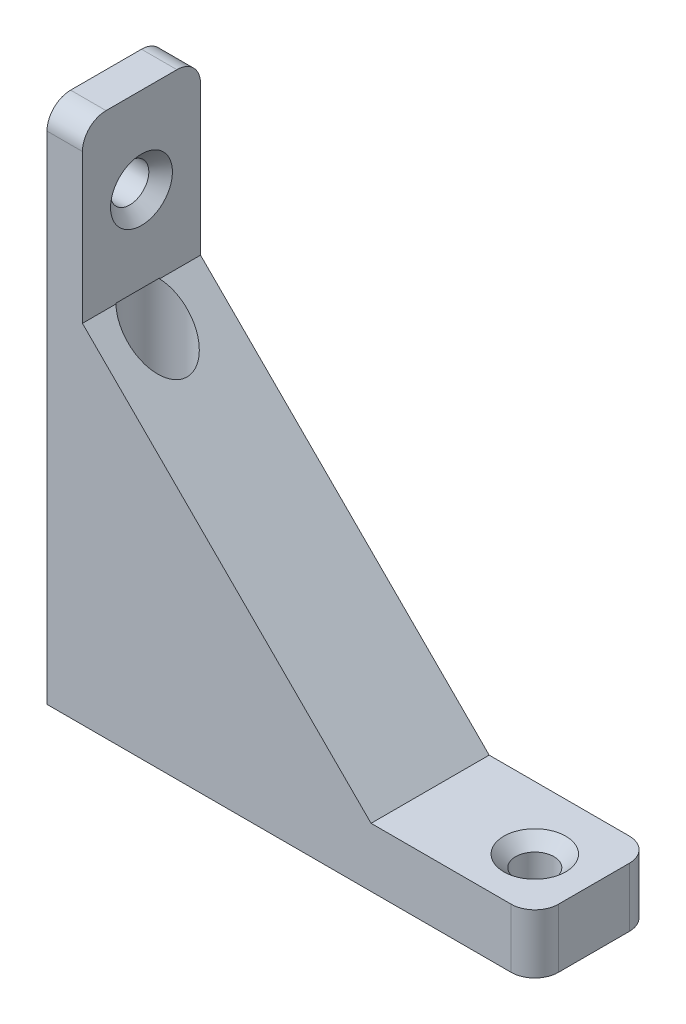
ISO-10303-21;
HEADER;
FILE_DESCRIPTION(('STEP AP214'),'2;1');
FILE_NAME('part.step','',(''),(''),'','','');
FILE_SCHEMA(('AUTOMOTIVE_DESIGN { 1 0 10303 214 1 1 1 1 }'));
ENDSEC;
DATA;
#1=APPLICATION_CONTEXT('core data for automotive mechanical design processes');
#2=APPLICATION_PROTOCOL_DEFINITION('international standard','automotive_design',2000,#1);
#3=PRODUCT_CONTEXT('',#1,'mechanical');
#4=PRODUCT('Part','Part','',(#3));
#5=PRODUCT_RELATED_PRODUCT_CATEGORY('part','',(#4));
#6=PRODUCT_DEFINITION_FORMATION('','',#4);
#7=PRODUCT_DEFINITION_CONTEXT('part definition',#1,'design');
#8=PRODUCT_DEFINITION('design','',#6,#7);
#9=PRODUCT_DEFINITION_SHAPE('','',#8);
#10=(LENGTH_UNIT() NAMED_UNIT(*) SI_UNIT(.MILLI.,.METRE.));
#11=(NAMED_UNIT(*) PLANE_ANGLE_UNIT() SI_UNIT($,.RADIAN.));
#12=(NAMED_UNIT(*) SI_UNIT($,.STERADIAN.) SOLID_ANGLE_UNIT());
#13=UNCERTAINTY_MEASURE_WITH_UNIT(LENGTH_MEASURE(1.E-05),#10,'distance_accuracy_value','');
#14=(GEOMETRIC_REPRESENTATION_CONTEXT(3) GLOBAL_UNCERTAINTY_ASSIGNED_CONTEXT((#13)) GLOBAL_UNIT_ASSIGNED_CONTEXT((#10,
#11,#12)) REPRESENTATION_CONTEXT('',''));
#15=CARTESIAN_POINT('',(0.,0.,0.));
#16=DIRECTION('',(0.,0.,1.));
#17=DIRECTION('',(1.,0.,0.));
#18=AXIS2_PLACEMENT_3D('',#15,#16,#17);
#19=CARTESIAN_POINT('',(3.,29.4386493614491,10.));
#20=DIRECTION('',(-1.,0.,0.));
#21=DIRECTION('',(0.,0.,1.));
#22=AXIS2_PLACEMENT_3D('',#19,#20,#21);
#23=PLANE('',#22);
#24=CARTESIAN_POINT('',(3.,36.7388925496166,5.));
#25=DIRECTION('',(-1.,0.,0.));
#26=DIRECTION('',(0.,0.,1.));
#27=AXIS2_PLACEMENT_3D('',#24,#25,#26);
#28=CIRCLE('',#27,2.62000000000002);
#29=CARTESIAN_POINT('',(3.,36.7388925496166,7.62000000000002));
#30=VERTEX_POINT('',#29);
#31=EDGE_CURVE('E172',#30,#30,#28,.T.);
#32=ORIENTED_EDGE('',*,*,#31,.T.);
#33=EDGE_LOOP('',(#32));
#34=FACE_BOUND('',#33,.T.);
#35=DIRECTION('',(0.,1.,0.));
#36=VECTOR('',#35,1.);
#37=CARTESIAN_POINT('',(3.,29.4386493614491,0.));
#38=LINE('',#37,#36);
#39=CARTESIAN_POINT('',(3.,29.4386493614491,0.));
#40=VERTEX_POINT('',#39);
#41=CARTESIAN_POINT('',(3.,42.039135737784,0.));
#42=VERTEX_POINT('',#41);
#43=EDGE_CURVE('E221',#40,#42,#38,.T.);
#44=ORIENTED_EDGE('',*,*,#43,.T.);
#45=CARTESIAN_POINT('',(3.,42.039135737784,2.));
#46=DIRECTION('',(-1.,0.,0.));
#47=DIRECTION('',(0.,0.,1.));
#48=AXIS2_PLACEMENT_3D('',#45,#46,#47);
#49=CIRCLE('',#48,2.);
#50=CARTESIAN_POINT('',(3.,44.039135737784,2.));
#51=VERTEX_POINT('',#50);
#52=EDGE_CURVE('E200',#42,#51,#49,.F.);
#53=ORIENTED_EDGE('',*,*,#52,.T.);
#54=DIRECTION('',(0.,0.,-1.));
#55=VECTOR('',#54,1.);
#56=CARTESIAN_POINT('',(3.,44.039135737784,10.));
#57=LINE('',#56,#55);
#58=CARTESIAN_POINT('',(3.,44.039135737784,8.));
#59=VERTEX_POINT('',#58);
#60=EDGE_CURVE('E155',#59,#51,#57,.T.);
#61=ORIENTED_EDGE('',*,*,#60,.F.);
#62=CARTESIAN_POINT('',(3.,42.039135737784,8.));
#63=DIRECTION('',(-1.,0.,0.));
#64=DIRECTION('',(0.,0.,1.));
#65=AXIS2_PLACEMENT_3D('',#62,#63,#64);
#66=CIRCLE('',#65,2.);
#67=CARTESIAN_POINT('',(3.,42.039135737784,10.));
#68=VERTEX_POINT('',#67);
#69=EDGE_CURVE('E198',#59,#68,#66,.F.);
#70=ORIENTED_EDGE('',*,*,#69,.T.);
#71=DIRECTION('',(0.,1.,0.));
#72=VECTOR('',#71,1.);
#73=CARTESIAN_POINT('',(3.,29.4386493614491,10.));
#74=LINE('',#73,#72);
#75=CARTESIAN_POINT('',(3.,29.4386493614491,10.));
#76=VERTEX_POINT('',#75);
#77=EDGE_CURVE('E229',#76,#68,#74,.T.);
#78=ORIENTED_EDGE('',*,*,#77,.F.);
#79=DIRECTION('',(0.,0.,-1.));
#80=VECTOR('',#79,1.);
#81=CARTESIAN_POINT('',(3.,29.4386493614491,10.));
#82=LINE('',#81,#80);
#83=CARTESIAN_POINT('',(3.,29.4386493614491,7.17137786526684));
#84=VERTEX_POINT('',#83);
#85=EDGE_CURVE('E254',#76,#84,#82,.T.);
#86=ORIENTED_EDGE('',*,*,#85,.T.);
#87=DIRECTION('',(0.,-1.,0.));
#88=VECTOR('',#87,1.);
#89=CARTESIAN_POINT('',(3.,29.5,7.17137786526684));
#90=LINE('',#89,#88);
#91=CARTESIAN_POINT('',(3.,29.5,7.17137786526684));
#92=VERTEX_POINT('',#91);
#93=EDGE_CURVE('E141',#92,#84,#90,.T.);
#94=ORIENTED_EDGE('',*,*,#93,.F.);
#95=DIRECTION('',(0.,0.,-1.));
#96=VECTOR('',#95,1.);
#97=CARTESIAN_POINT('',(3.,29.5,10.));
#98=LINE('',#97,#96);
#99=CARTESIAN_POINT('',(3.,29.5,3.46862213473316));
#100=VERTEX_POINT('',#99);
#101=EDGE_CURVE('E145',#92,#100,#98,.T.);
#102=ORIENTED_EDGE('',*,*,#101,.T.);
#103=DIRECTION('',(0.,-1.,0.));
#104=VECTOR('',#103,1.);
#105=CARTESIAN_POINT('',(3.,29.5,3.46862213473316));
#106=LINE('',#105,#104);
#107=CARTESIAN_POINT('',(3.,29.4386493614491,3.46862213473316));
#108=VERTEX_POINT('',#107);
#109=EDGE_CURVE('E130',#108,#100,#106,.F.);
#110=ORIENTED_EDGE('',*,*,#109,.F.);
#111=EDGE_CURVE('E242',#108,#40,#82,.T.);
#112=ORIENTED_EDGE('',*,*,#111,.T.);
#113=EDGE_LOOP('',(#44,#53,#61,#70,#78,#86,#94,#102,#110,#112));
#114=FACE_BOUND('',#113,.T.);
#115=ADVANCED_FACE('F35',(#34,#114),#23,.F.);
#116=CARTESIAN_POINT('',(0.,44.039135737784,10.));
#117=DIRECTION('',(0.,1.,0.));
#118=DIRECTION('',(0.,0.,1.));
#119=AXIS2_PLACEMENT_3D('',#116,#117,#118);
#120=PLANE('',#119);
#121=ORIENTED_EDGE('',*,*,#60,.T.);
#122=DIRECTION('',(1.,0.,0.));
#123=VECTOR('',#122,1.);
#124=CARTESIAN_POINT('',(0.,44.039135737784,2.));
#125=LINE('',#124,#123);
#126=CARTESIAN_POINT('',(0.,44.039135737784,2.));
#127=VERTEX_POINT('',#126);
#128=EDGE_CURVE('E50',#51,#127,#125,.F.);
#129=ORIENTED_EDGE('',*,*,#128,.T.);
#130=DIRECTION('',(0.,0.,-1.));
#131=VECTOR('',#130,1.);
#132=CARTESIAN_POINT('',(0.,44.039135737784,10.));
#133=LINE('',#132,#131);
#134=CARTESIAN_POINT('',(0.,44.039135737784,8.));
#135=VERTEX_POINT('',#134);
#136=EDGE_CURVE('E208',#135,#127,#133,.T.);
#137=ORIENTED_EDGE('',*,*,#136,.F.);
#138=DIRECTION('',(1.,0.,0.));
#139=VECTOR('',#138,1.);
#140=CARTESIAN_POINT('',(3.,44.039135737784,8.));
#141=LINE('',#140,#139);
#142=EDGE_CURVE('E202',#135,#59,#141,.T.);
#143=ORIENTED_EDGE('',*,*,#142,.T.);
#144=EDGE_LOOP('',(#121,#129,#137,#143));
#145=FACE_BOUND('',#144,.T.);
#146=ADVANCED_FACE('F207',(#145),#120,.T.);
#147=CARTESIAN_POINT('',(0.,0.,10.));
#148=DIRECTION('',(-1.,0.,0.));
#149=DIRECTION('',(0.,0.,1.));
#150=AXIS2_PLACEMENT_3D('',#147,#148,#149);
#151=PLANE('',#150);
#152=CARTESIAN_POINT('',(0.,36.7388925496166,5.));
#153=DIRECTION('',(-1.,0.,0.));
#154=DIRECTION('',(0.,0.,1.));
#155=AXIS2_PLACEMENT_3D('',#152,#153,#154);
#156=CIRCLE('',#155,1.62);
#157=CARTESIAN_POINT('',(0.,36.7388925496166,6.62));
#158=VERTEX_POINT('',#157);
#159=EDGE_CURVE('E146',#158,#158,#156,.T.);
#160=ORIENTED_EDGE('',*,*,#159,.F.);
#161=EDGE_LOOP('',(#160));
#162=FACE_BOUND('',#161,.T.);
#163=ORIENTED_EDGE('',*,*,#136,.T.);
#164=CARTESIAN_POINT('',(0.,42.039135737784,2.));
#165=DIRECTION('',(-1.,0.,0.));
#166=DIRECTION('',(0.,0.,1.));
#167=AXIS2_PLACEMENT_3D('',#164,#165,#166);
#168=CIRCLE('',#167,2.);
#169=CARTESIAN_POINT('',(0.,42.039135737784,0.));
#170=VERTEX_POINT('',#169);
#171=EDGE_CURVE('E11',#127,#170,#168,.T.);
#172=ORIENTED_EDGE('',*,*,#171,.T.);
#173=DIRECTION('',(0.,1.,0.));
#174=VECTOR('',#173,1.);
#175=CARTESIAN_POINT('',(0.,0.,0.));
#176=LINE('',#175,#174);
#177=CARTESIAN_POINT('',(0.,0.,0.));
#178=VERTEX_POINT('',#177);
#179=EDGE_CURVE('E225',#178,#170,#176,.T.);
#180=ORIENTED_EDGE('',*,*,#179,.F.);
#181=DIRECTION('',(0.,0.,-1.));
#182=VECTOR('',#181,1.);
#183=CARTESIAN_POINT('',(0.,0.,10.));
#184=LINE('',#183,#182);
#185=CARTESIAN_POINT('',(0.,0.,10.));
#186=VERTEX_POINT('',#185);
#187=EDGE_CURVE('E213',#186,#178,#184,.T.);
#188=ORIENTED_EDGE('',*,*,#187,.F.);
#189=DIRECTION('',(0.,1.,0.));
#190=VECTOR('',#189,1.);
#191=CARTESIAN_POINT('',(0.,5.,10.));
#192=LINE('',#191,#190);
#193=CARTESIAN_POINT('',(0.,42.039135737784,10.));
#194=VERTEX_POINT('',#193);
#195=EDGE_CURVE('E231',#186,#194,#192,.T.);
#196=ORIENTED_EDGE('',*,*,#195,.T.);
#197=CARTESIAN_POINT('',(0.,42.039135737784,8.));
#198=DIRECTION('',(-1.,0.,0.));
#199=DIRECTION('',(0.,0.,1.));
#200=AXIS2_PLACEMENT_3D('',#197,#198,#199);
#201=CIRCLE('',#200,2.);
#202=EDGE_CURVE('E43',#194,#135,#201,.T.);
#203=ORIENTED_EDGE('',*,*,#202,.T.);
#204=EDGE_LOOP('',(#163,#172,#180,#188,#196,#203));
#205=FACE_BOUND('',#204,.T.);
#206=ADVANCED_FACE('F275',(#162,#205),#151,.T.);
#207=CARTESIAN_POINT('',(0.,0.,10.));
#208=DIRECTION('',(0.,1.,0.));
#209=DIRECTION('',(0.,0.,1.));
#210=AXIS2_PLACEMENT_3D('',#207,#208,#209);
#211=PLANE('',#210);
#212=CARTESIAN_POINT('',(4.68,0.,5.32));
#213=DIRECTION('',(0.,1.,0.));
#214=DIRECTION('',(0.,0.,1.));
#215=AXIS2_PLACEMENT_3D('',#212,#213,#214);
#216=CIRCLE('',#215,1.62);
#217=CARTESIAN_POINT('',(4.68,0.,6.94));
#218=VERTEX_POINT('',#217);
#219=EDGE_CURVE('E140',#218,#218,#216,.T.);
#220=ORIENTED_EDGE('',*,*,#219,.T.);
#221=EDGE_LOOP('',(#220));
#222=FACE_BOUND('',#221,.T.);
#223=CARTESIAN_POINT('',(36.62,0.,5.32));
#224=DIRECTION('',(0.,1.,0.));
#225=DIRECTION('',(0.,0.,1.));
#226=AXIS2_PLACEMENT_3D('',#223,#224,#225);
#227=CIRCLE('',#226,1.62000000000001);
#228=CARTESIAN_POINT('',(36.62,0.,6.94));
#229=VERTEX_POINT('',#228);
#230=EDGE_CURVE('E217',#229,#229,#227,.T.);
#231=ORIENTED_EDGE('',*,*,#230,.T.);
#232=EDGE_LOOP('',(#231));
#233=FACE_BOUND('',#232,.T.);
#234=DIRECTION('',(0.,0.,-1.));
#235=VECTOR('',#234,1.);
#236=CARTESIAN_POINT('',(41.3,0.,10.));
#237=LINE('',#236,#235);
#238=CARTESIAN_POINT('',(41.3,0.,8.));
#239=VERTEX_POINT('',#238);
#240=CARTESIAN_POINT('',(41.3,0.,2.));
#241=VERTEX_POINT('',#240);
#242=EDGE_CURVE('E261',#239,#241,#237,.T.);
#243=ORIENTED_EDGE('',*,*,#242,.F.);
#244=CARTESIAN_POINT('',(39.3,0.,8.));
#245=DIRECTION('',(0.,1.,0.));
#246=DIRECTION('',(0.,0.,1.));
#247=AXIS2_PLACEMENT_3D('',#244,#245,#246);
#248=CIRCLE('',#247,2.);
#249=CARTESIAN_POINT('',(39.3,0.,10.));
#250=VERTEX_POINT('',#249);
#251=EDGE_CURVE('E191',#239,#250,#248,.F.);
#252=ORIENTED_EDGE('',*,*,#251,.T.);
#253=DIRECTION('',(1.,0.,0.));
#254=VECTOR('',#253,1.);
#255=CARTESIAN_POINT('',(0.,0.,10.));
#256=LINE('',#255,#254);
#257=EDGE_CURVE('E234',#186,#250,#256,.T.);
#258=ORIENTED_EDGE('',*,*,#257,.F.);
#259=ORIENTED_EDGE('',*,*,#187,.T.);
#260=DIRECTION('',(1.,0.,0.));
#261=VECTOR('',#260,1.);
#262=CARTESIAN_POINT('',(0.,0.,0.));
#263=LINE('',#262,#261);
#264=CARTESIAN_POINT('',(39.3,0.,0.));
#265=VERTEX_POINT('',#264);
#266=EDGE_CURVE('E246',#178,#265,#263,.T.);
#267=ORIENTED_EDGE('',*,*,#266,.T.);
#268=CARTESIAN_POINT('',(39.3,0.,2.));
#269=DIRECTION('',(0.,1.,0.));
#270=DIRECTION('',(0.,0.,1.));
#271=AXIS2_PLACEMENT_3D('',#268,#269,#270);
#272=CIRCLE('',#271,2.);
#273=EDGE_CURVE('E189',#265,#241,#272,.F.);
#274=ORIENTED_EDGE('',*,*,#273,.T.);
#275=EDGE_LOOP('',(#243,#252,#258,#259,#267,#274));
#276=FACE_BOUND('',#275,.T.);
#277=ADVANCED_FACE('F268',(#222,#233,#276),#211,.F.);
#278=CARTESIAN_POINT('',(41.3,0.,10.));
#279=DIRECTION('',(-1.,0.,0.));
#280=DIRECTION('',(0.,0.,1.));
#281=AXIS2_PLACEMENT_3D('',#278,#279,#280);
#282=PLANE('',#281);
#283=DIRECTION('',(0.,0.,-1.));
#284=VECTOR('',#283,1.);
#285=CARTESIAN_POINT('',(41.3,5.00000000000002,10.));
#286=LINE('',#285,#284);
#287=CARTESIAN_POINT('',(41.3,5.00000000000002,8.));
#288=VERTEX_POINT('',#287);
#289=CARTESIAN_POINT('',(41.3,5.00000000000002,2.));
#290=VERTEX_POINT('',#289);
#291=EDGE_CURVE('E258',#288,#290,#286,.T.);
#292=ORIENTED_EDGE('',*,*,#291,.F.);
#293=DIRECTION('',(0.,1.,0.));
#294=VECTOR('',#293,1.);
#295=CARTESIAN_POINT('',(41.3,0.,8.));
#296=LINE('',#295,#294);
#297=EDGE_CURVE('E187',#288,#239,#296,.F.);
#298=ORIENTED_EDGE('',*,*,#297,.T.);
#299=ORIENTED_EDGE('',*,*,#242,.T.);
#300=DIRECTION('',(0.,1.,0.));
#301=VECTOR('',#300,1.);
#302=CARTESIAN_POINT('',(41.3,5.00000000000002,2.));
#303=LINE('',#302,#301);
#304=EDGE_CURVE('E184',#241,#290,#303,.T.);
#305=ORIENTED_EDGE('',*,*,#304,.T.);
#306=EDGE_LOOP('',(#292,#298,#299,#305));
#307=FACE_BOUND('',#306,.T.);
#308=ADVANCED_FACE('F291',(#307),#282,.F.);
#309=CARTESIAN_POINT('',(27.4386493614489,5.,10.));
#310=DIRECTION('',(0.,1.,0.));
#311=DIRECTION('',(-1.,0.,0.));
#312=AXIS2_PLACEMENT_3D('',#309,#310,#311);
#313=PLANE('',#312);
#314=CARTESIAN_POINT('',(36.62,5.00000000000001,5.32));
#315=DIRECTION('',(0.,1.,0.));
#316=DIRECTION('',(-1.,0.,0.));
#317=AXIS2_PLACEMENT_3D('',#314,#315,#316);
#318=CIRCLE('',#317,2.62000000000002);
#319=CARTESIAN_POINT('',(34.,5.00000000000001,5.32));
#320=VERTEX_POINT('',#319);
#321=EDGE_CURVE('E164',#320,#320,#318,.F.);
#322=ORIENTED_EDGE('',*,*,#321,.T.);
#323=EDGE_LOOP('',(#322));
#324=FACE_BOUND('',#323,.T.);
#325=DIRECTION('',(1.,0.,0.));
#326=VECTOR('',#325,1.);
#327=CARTESIAN_POINT('',(27.4386493614489,5.,10.));
#328=LINE('',#327,#326);
#329=CARTESIAN_POINT('',(27.4386493614489,5.,10.));
#330=VERTEX_POINT('',#329);
#331=CARTESIAN_POINT('',(39.3,5.00000000000001,10.));
#332=VERTEX_POINT('',#331);
#333=EDGE_CURVE('E237',#330,#332,#328,.T.);
#334=ORIENTED_EDGE('',*,*,#333,.T.);
#335=CARTESIAN_POINT('',(39.3,5.00000000000001,8.));
#336=DIRECTION('',(0.,1.,0.));
#337=DIRECTION('',(-1.,0.,0.));
#338=AXIS2_PLACEMENT_3D('',#335,#336,#337);
#339=CIRCLE('',#338,2.);
#340=EDGE_CURVE('E182',#332,#288,#339,.T.);
#341=ORIENTED_EDGE('',*,*,#340,.T.);
#342=ORIENTED_EDGE('',*,*,#291,.T.);
#343=CARTESIAN_POINT('',(39.3,5.00000000000001,2.));
#344=DIRECTION('',(0.,1.,0.));
#345=DIRECTION('',(-1.,0.,0.));
#346=AXIS2_PLACEMENT_3D('',#343,#344,#345);
#347=CIRCLE('',#346,2.);
#348=CARTESIAN_POINT('',(39.3,5.00000000000001,0.));
#349=VERTEX_POINT('',#348);
#350=EDGE_CURVE('E180',#290,#349,#347,.T.);
#351=ORIENTED_EDGE('',*,*,#350,.T.);
#352=DIRECTION('',(1.,0.,0.));
#353=VECTOR('',#352,1.);
#354=CARTESIAN_POINT('',(27.4386493614489,5.,0.));
#355=LINE('',#354,#353);
#356=CARTESIAN_POINT('',(27.4386493614489,5.,0.));
#357=VERTEX_POINT('',#356);
#358=EDGE_CURVE('E249',#357,#349,#355,.T.);
#359=ORIENTED_EDGE('',*,*,#358,.F.);
#360=DIRECTION('',(0.,0.,-1.));
#361=VECTOR('',#360,1.);
#362=CARTESIAN_POINT('',(27.4386493614489,5.,10.));
#363=LINE('',#362,#361);
#364=EDGE_CURVE('E256',#330,#357,#363,.T.);
#365=ORIENTED_EDGE('',*,*,#364,.F.);
#366=EDGE_LOOP('',(#334,#341,#342,#351,#359,#365));
#367=FACE_BOUND('',#366,.T.);
#368=ADVANCED_FACE('F433',(#324,#367),#313,.T.);
#369=CARTESIAN_POINT('',(3.,29.4386493614491,10.));
#370=DIRECTION('',(0.707106781186551,0.707106781186544,0.));
#371=DIRECTION('',(-0.707106781186544,0.707106781186551,0.));
#372=AXIS2_PLACEMENT_3D('',#369,#370,#371);
#373=PLANE('',#372);
#374=ORIENTED_EDGE('',*,*,#111,.F.);
#375=CARTESIAN_POINT('',(4.68,27.7586493614491,5.32));
#376=DIRECTION('',(0.707106781186551,0.707106781186544,0.));
#377=DIRECTION('',(0.707106781186544,-0.707106781186551,0.));
#378=AXIS2_PLACEMENT_3D('',#375,#376,#377);
#379=ELLIPSE('',#378,3.53553390593276,2.5);
#380=EDGE_CURVE('E136',#108,#84,#379,.F.);
#381=ORIENTED_EDGE('',*,*,#380,.T.);
#382=ORIENTED_EDGE('',*,*,#85,.F.);
#383=DIRECTION('',(0.707106781186544,-0.707106781186551,0.));
#384=VECTOR('',#383,1.);
#385=CARTESIAN_POINT('',(3.,29.4386493614491,10.));
#386=LINE('',#385,#384);
#387=EDGE_CURVE('E240',#76,#330,#386,.T.);
#388=ORIENTED_EDGE('',*,*,#387,.T.);
#389=ORIENTED_EDGE('',*,*,#364,.T.);
#390=DIRECTION('',(0.707106781186544,-0.707106781186551,0.));
#391=VECTOR('',#390,1.);
#392=CARTESIAN_POINT('',(3.,29.4386493614491,0.));
#393=LINE('',#392,#391);
#394=EDGE_CURVE('E232',#40,#357,#393,.T.);
#395=ORIENTED_EDGE('',*,*,#394,.F.);
#396=EDGE_LOOP('',(#374,#381,#382,#388,#389,#395));
#397=FACE_BOUND('',#396,.T.);
#398=ADVANCED_FACE('F282',(#397),#373,.T.);
#399=CARTESIAN_POINT('',(0.,0.,10.));
#400=DIRECTION('',(0.,0.,-1.));
#401=DIRECTION('',(-1.,0.,0.));
#402=AXIS2_PLACEMENT_3D('',#399,#400,#401);
#403=PLANE('',#402);
#404=ORIENTED_EDGE('',*,*,#257,.T.);
#405=DIRECTION('',(0.,1.,0.));
#406=VECTOR('',#405,1.);
#407=CARTESIAN_POINT('',(39.3,0.,10.));
#408=LINE('',#407,#406);
#409=EDGE_CURVE('E177',#250,#332,#408,.T.);
#410=ORIENTED_EDGE('',*,*,#409,.T.);
#411=ORIENTED_EDGE('',*,*,#333,.F.);
#412=ORIENTED_EDGE('',*,*,#387,.F.);
#413=ORIENTED_EDGE('',*,*,#77,.T.);
#414=DIRECTION('',(1.,0.,0.));
#415=VECTOR('',#414,1.);
#416=CARTESIAN_POINT('',(0.,42.039135737784,10.));
#417=LINE('',#416,#415);
#418=EDGE_CURVE('E175',#68,#194,#417,.F.);
#419=ORIENTED_EDGE('',*,*,#418,.T.);
#420=ORIENTED_EDGE('',*,*,#195,.F.);
#421=EDGE_LOOP('',(#404,#410,#411,#412,#413,#419,#420));
#422=FACE_BOUND('',#421,.T.);
#423=ADVANCED_FACE('F297',(#422),#403,.F.);
#424=CARTESIAN_POINT('',(0.,0.,0.));
#425=DIRECTION('',(0.,0.,-1.));
#426=DIRECTION('',(-1.,0.,0.));
#427=AXIS2_PLACEMENT_3D('',#424,#425,#426);
#428=PLANE('',#427);
#429=ORIENTED_EDGE('',*,*,#358,.T.);
#430=DIRECTION('',(0.,1.,0.));
#431=VECTOR('',#430,1.);
#432=CARTESIAN_POINT('',(39.3,0.,0.));
#433=LINE('',#432,#431);
#434=EDGE_CURVE('E196',#349,#265,#433,.F.);
#435=ORIENTED_EDGE('',*,*,#434,.T.);
#436=ORIENTED_EDGE('',*,*,#266,.F.);
#437=ORIENTED_EDGE('',*,*,#179,.T.);
#438=DIRECTION('',(1.,0.,0.));
#439=VECTOR('',#438,1.);
#440=CARTESIAN_POINT('',(0.,42.039135737784,0.));
#441=LINE('',#440,#439);
#442=EDGE_CURVE('E193',#170,#42,#441,.T.);
#443=ORIENTED_EDGE('',*,*,#442,.T.);
#444=ORIENTED_EDGE('',*,*,#43,.F.);
#445=ORIENTED_EDGE('',*,*,#394,.T.);
#446=EDGE_LOOP('',(#429,#435,#436,#437,#443,#444,#445));
#447=FACE_BOUND('',#446,.T.);
#448=ADVANCED_FACE('F272',(#447),#428,.T.);
#449=CARTESIAN_POINT('',(36.62,-2.99999999999999,5.32));
#450=DIRECTION('',(0.,1.,0.));
#451=DIRECTION('',(-1.,0.,0.));
#452=AXIS2_PLACEMENT_3D('',#449,#450,#451);
#453=CYLINDRICAL_SURFACE('',#452,1.62000000000001);
#454=CARTESIAN_POINT('',(36.62,4.,5.32));
#455=DIRECTION('',(0.,1.,0.));
#456=DIRECTION('',(0.,0.,1.));
#457=AXIS2_PLACEMENT_3D('',#454,#455,#456);
#458=CIRCLE('',#457,1.62000000000001);
#459=CARTESIAN_POINT('',(36.62,4.,6.94));
#460=VERTEX_POINT('',#459);
#461=EDGE_CURVE('E161',#460,#460,#458,.T.);
#462=ORIENTED_EDGE('',*,*,#461,.T.);
#463=EDGE_LOOP('',(#462));
#464=FACE_BOUND('',#463,.T.);
#465=ORIENTED_EDGE('',*,*,#230,.F.);
#466=EDGE_LOOP('',(#465));
#467=FACE_BOUND('',#466,.T.);
#468=ADVANCED_FACE('F404',(#464,#467),#453,.F.);
#469=CARTESIAN_POINT('',(4.68,-19.5,5.32));
#470=DIRECTION('',(0.,1.,0.));
#471=DIRECTION('',(0.,0.,1.));
#472=AXIS2_PLACEMENT_3D('',#469,#470,#471);
#473=CYLINDRICAL_SURFACE('',#472,1.62);
#474=CARTESIAN_POINT('',(4.68,3.99999999999999,5.32));
#475=DIRECTION('',(0.,1.,0.));
#476=DIRECTION('',(0.,0.,1.));
#477=AXIS2_PLACEMENT_3D('',#474,#475,#476);
#478=CIRCLE('',#477,1.62);
#479=CARTESIAN_POINT('',(4.68,3.99999999999999,6.94));
#480=VERTEX_POINT('',#479);
#481=EDGE_CURVE('E150',#480,#480,#478,.T.);
#482=ORIENTED_EDGE('',*,*,#481,.T.);
#483=EDGE_LOOP('',(#482));
#484=FACE_BOUND('',#483,.T.);
#485=ORIENTED_EDGE('',*,*,#219,.F.);
#486=EDGE_LOOP('',(#485));
#487=FACE_BOUND('',#486,.T.);
#488=ADVANCED_FACE('F391',(#484,#487),#473,.F.);
#489=CARTESIAN_POINT('',(4.68,29.5,5.32));
#490=DIRECTION('',(0.,1.,0.));
#491=DIRECTION('',(0.,0.,1.));
#492=AXIS2_PLACEMENT_3D('',#489,#490,#491);
#493=PLANE('',#492);
#494=CARTESIAN_POINT('',(4.68,29.5,5.32));
#495=DIRECTION('',(0.,1.,0.));
#496=DIRECTION('',(0.,0.,1.));
#497=AXIS2_PLACEMENT_3D('',#494,#495,#496);
#498=CIRCLE('',#497,2.5);
#499=EDGE_CURVE('E133',#100,#92,#498,.T.);
#500=ORIENTED_EDGE('',*,*,#499,.F.);
#501=ORIENTED_EDGE('',*,*,#101,.F.);
#502=EDGE_LOOP('',(#500,#501));
#503=FACE_BOUND('',#502,.T.);
#504=ADVANCED_FACE('F144',(#503),#493,.F.);
#505=CARTESIAN_POINT('',(4.68,29.5,5.32));
#506=DIRECTION('',(0.,-1.,0.));
#507=DIRECTION('',(0.,0.,-1.));
#508=AXIS2_PLACEMENT_3D('',#505,#506,#507);
#509=CYLINDRICAL_SURFACE('',#508,2.5);
#510=CARTESIAN_POINT('',(4.68,4.87999999999998,5.32));
#511=DIRECTION('',(0.,1.,0.));
#512=DIRECTION('',(0.,0.,1.));
#513=AXIS2_PLACEMENT_3D('',#510,#511,#512);
#514=CIRCLE('',#513,2.5);
#515=CARTESIAN_POINT('',(4.68,4.87999999999998,7.82));
#516=VERTEX_POINT('',#515);
#517=EDGE_CURVE('E153',#516,#516,#514,.F.);
#518=ORIENTED_EDGE('',*,*,#517,.T.);
#519=EDGE_LOOP('',(#518));
#520=FACE_BOUND('',#519,.T.);
#521=ORIENTED_EDGE('',*,*,#109,.T.);
#522=ORIENTED_EDGE('',*,*,#499,.T.);
#523=ORIENTED_EDGE('',*,*,#93,.T.);
#524=ORIENTED_EDGE('',*,*,#380,.F.);
#525=EDGE_LOOP('',(#521,#522,#523,#524));
#526=FACE_BOUND('',#525,.T.);
#527=ADVANCED_FACE('F132',(#520,#526),#509,.F.);
#528=CARTESIAN_POINT('',(4.68,5.,5.32));
#529=DIRECTION('',(0.,1.,0.));
#530=DIRECTION('',(0.,0.,1.));
#531=AXIS2_PLACEMENT_3D('',#528,#529,#530);
#532=CONICAL_SURFACE('',#531,2.62000000000002,0.785398163397453);
#533=ORIENTED_EDGE('',*,*,#481,.F.);
#534=EDGE_LOOP('',(#533));
#535=FACE_BOUND('',#534,.T.);
#536=ORIENTED_EDGE('',*,*,#517,.F.);
#537=EDGE_LOOP('',(#536));
#538=FACE_BOUND('',#537,.T.);
#539=ADVANCED_FACE('F313',(#535,#538),#532,.F.);
#540=CARTESIAN_POINT('',(36.62,3.99999999999999,5.32));
#541=DIRECTION('',(0.,1.,0.));
#542=DIRECTION('',(0.,0.,1.));
#543=AXIS2_PLACEMENT_3D('',#540,#541,#542);
#544=CONICAL_SURFACE('',#543,1.62000000000001,0.785398163397451);
#545=ORIENTED_EDGE('',*,*,#321,.F.);
#546=EDGE_LOOP('',(#545));
#547=FACE_BOUND('',#546,.T.);
#548=ORIENTED_EDGE('',*,*,#461,.F.);
#549=EDGE_LOOP('',(#548));
#550=FACE_BOUND('',#549,.T.);
#551=ADVANCED_FACE('F316',(#547,#550),#544,.F.);
#552=CARTESIAN_POINT('',(-21.5,36.7388925496166,5.));
#553=DIRECTION('',(1.,0.,0.));
#554=DIRECTION('',(0.,0.,-1.));
#555=AXIS2_PLACEMENT_3D('',#552,#553,#554);
#556=CYLINDRICAL_SURFACE('',#555,1.62);
#557=CARTESIAN_POINT('',(1.99999999999998,36.7388925496166,5.));
#558=DIRECTION('',(-1.,0.,0.));
#559=DIRECTION('',(0.,0.,1.));
#560=AXIS2_PLACEMENT_3D('',#557,#558,#559);
#561=CIRCLE('',#560,1.62);
#562=CARTESIAN_POINT('',(1.99999999999998,36.7388925496166,6.62));
#563=VERTEX_POINT('',#562);
#564=EDGE_CURVE('E167',#563,#563,#561,.F.);
#565=ORIENTED_EDGE('',*,*,#564,.T.);
#566=EDGE_LOOP('',(#565));
#567=FACE_BOUND('',#566,.T.);
#568=ORIENTED_EDGE('',*,*,#159,.T.);
#569=EDGE_LOOP('',(#568));
#570=FACE_BOUND('',#569,.T.);
#571=ADVANCED_FACE('F320',(#567,#570),#556,.F.);
#572=CARTESIAN_POINT('',(1.99999999999998,36.7388925496166,5.));
#573=DIRECTION('',(1.,0.,0.));
#574=DIRECTION('',(0.,0.,-1.));
#575=AXIS2_PLACEMENT_3D('',#572,#573,#574);
#576=CONICAL_SURFACE('',#575,1.62,0.78539816339745);
#577=ORIENTED_EDGE('',*,*,#31,.F.);
#578=EDGE_LOOP('',(#577));
#579=FACE_BOUND('',#578,.T.);
#580=ORIENTED_EDGE('',*,*,#564,.F.);
#581=EDGE_LOOP('',(#580));
#582=FACE_BOUND('',#581,.T.);
#583=ADVANCED_FACE('F322',(#579,#582),#576,.F.);
#584=CARTESIAN_POINT('',(39.3,0.,8.));
#585=DIRECTION('',(0.,1.,0.));
#586=DIRECTION('',(0.,0.,1.));
#587=AXIS2_PLACEMENT_3D('',#584,#585,#586);
#588=CYLINDRICAL_SURFACE('',#587,2.);
#589=ORIENTED_EDGE('',*,*,#251,.F.);
#590=ORIENTED_EDGE('',*,*,#297,.F.);
#591=ORIENTED_EDGE('',*,*,#340,.F.);
#592=ORIENTED_EDGE('',*,*,#409,.F.);
#593=EDGE_LOOP('',(#589,#590,#591,#592));
#594=FACE_BOUND('',#593,.T.);
#595=ADVANCED_FACE('F294',(#594),#588,.T.);
#596=CARTESIAN_POINT('',(39.3,0.,2.));
#597=DIRECTION('',(0.,-1.,0.));
#598=DIRECTION('',(0.,0.,-1.));
#599=AXIS2_PLACEMENT_3D('',#596,#597,#598);
#600=CYLINDRICAL_SURFACE('',#599,2.);
#601=ORIENTED_EDGE('',*,*,#273,.F.);
#602=ORIENTED_EDGE('',*,*,#434,.F.);
#603=ORIENTED_EDGE('',*,*,#350,.F.);
#604=ORIENTED_EDGE('',*,*,#304,.F.);
#605=EDGE_LOOP('',(#601,#602,#603,#604));
#606=FACE_BOUND('',#605,.T.);
#607=ADVANCED_FACE('F286',(#606),#600,.T.);
#608=CARTESIAN_POINT('',(0.,42.039135737784,2.));
#609=DIRECTION('',(1.,0.,0.));
#610=DIRECTION('',(0.,0.,-1.));
#611=AXIS2_PLACEMENT_3D('',#608,#609,#610);
#612=CYLINDRICAL_SURFACE('',#611,2.);
#613=ORIENTED_EDGE('',*,*,#171,.F.);
#614=ORIENTED_EDGE('',*,*,#128,.F.);
#615=ORIENTED_EDGE('',*,*,#52,.F.);
#616=ORIENTED_EDGE('',*,*,#442,.F.);
#617=EDGE_LOOP('',(#613,#614,#615,#616));
#618=FACE_BOUND('',#617,.T.);
#619=ADVANCED_FACE('F278',(#618),#612,.T.);
#620=CARTESIAN_POINT('',(0.,42.039135737784,8.));
#621=DIRECTION('',(-1.,0.,0.));
#622=DIRECTION('',(0.,0.,1.));
#623=AXIS2_PLACEMENT_3D('',#620,#621,#622);
#624=CYLINDRICAL_SURFACE('',#623,2.);
#625=ORIENTED_EDGE('',*,*,#202,.F.);
#626=ORIENTED_EDGE('',*,*,#418,.F.);
#627=ORIENTED_EDGE('',*,*,#69,.F.);
#628=ORIENTED_EDGE('',*,*,#142,.F.);
#629=EDGE_LOOP('',(#625,#626,#627,#628));
#630=FACE_BOUND('',#629,.T.);
#631=ADVANCED_FACE('F37',(#630),#624,.T.);
#632=CLOSED_SHELL('',(#115,#146,#206,#277,#308,#368,#398,#423,#448,#468,#488,#504,#527,#539,
#551,#571,#583,#595,#607,#619,#631));
#633=MANIFOLD_SOLID_BREP('B2',#632);
#634=ADVANCED_BREP_SHAPE_REPRESENTATION('',(#18,#633),#14);
#635=SHAPE_DEFINITION_REPRESENTATION(#9,#634);
ENDSEC;
END-ISO-10303-21;
